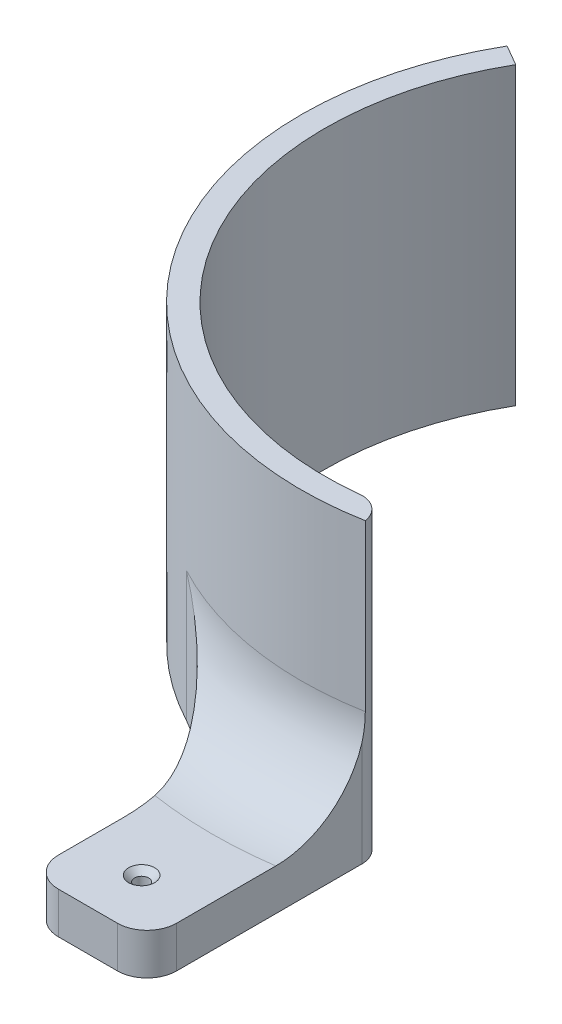
ISO-10303-21;
HEADER;
FILE_DESCRIPTION(('STEP AP214'),'2;1');
FILE_NAME('part.step','',(''),(''),'','','');
FILE_SCHEMA(('AUTOMOTIVE_DESIGN { 1 0 10303 214 1 1 1 1 }'));
ENDSEC;
DATA;
#1=APPLICATION_CONTEXT('core data for automotive mechanical design processes');
#2=APPLICATION_PROTOCOL_DEFINITION('international standard','automotive_design',2000,#1);
#3=PRODUCT_CONTEXT('',#1,'mechanical');
#4=PRODUCT('Part','Part','',(#3));
#5=PRODUCT_RELATED_PRODUCT_CATEGORY('part','',(#4));
#6=PRODUCT_DEFINITION_FORMATION('','',#4);
#7=PRODUCT_DEFINITION_CONTEXT('part definition',#1,'design');
#8=PRODUCT_DEFINITION('design','',#6,#7);
#9=PRODUCT_DEFINITION_SHAPE('','',#8);
#10=(LENGTH_UNIT() NAMED_UNIT(*) SI_UNIT(.MILLI.,.METRE.));
#11=(NAMED_UNIT(*) PLANE_ANGLE_UNIT() SI_UNIT($,.RADIAN.));
#12=(NAMED_UNIT(*) SI_UNIT($,.STERADIAN.) SOLID_ANGLE_UNIT());
#13=UNCERTAINTY_MEASURE_WITH_UNIT(LENGTH_MEASURE(1.E-05),#10,'distance_accuracy_value','');
#14=(GEOMETRIC_REPRESENTATION_CONTEXT(3) GLOBAL_UNCERTAINTY_ASSIGNED_CONTEXT((#13)) GLOBAL_UNIT_ASSIGNED_CONTEXT((#10,
#11,#12)) REPRESENTATION_CONTEXT('',''));
#15=CARTESIAN_POINT('',(0.,0.,0.));
#16=DIRECTION('',(0.,0.,1.));
#17=DIRECTION('',(1.,0.,0.));
#18=AXIS2_PLACEMENT_3D('',#15,#16,#17);
#19=CARTESIAN_POINT('',(0.,50.,0.));
#20=DIRECTION('',(0.,-1.,0.));
#21=DIRECTION('',(0.,0.,-1.));
#22=AXIS2_PLACEMENT_3D('',#19,#20,#21);
#23=CYLINDRICAL_SURFACE('',#22,55.);
#24=CARTESIAN_POINT('',(0.,22.,0.));
#25=DIRECTION('',(0.,1.,0.));
#26=DIRECTION('',(0.,0.,1.));
#27=AXIS2_PLACEMENT_3D('',#24,#25,#26);
#28=CIRCLE('',#27,55.);
#29=CARTESIAN_POINT('',(-25.8823529411765,22.,48.5294117647059));
#30=VERTEX_POINT('',#29);
#31=CARTESIAN_POINT('',(9.957629625156,22.,54.0910862550219));
#32=VERTEX_POINT('',#31);
#33=EDGE_CURVE('E249',#30,#32,#28,.T.);
#34=ORIENTED_EDGE('',*,*,#33,.T.);
#35=DIRECTION('',(0.,-1.,0.));
#36=VECTOR('',#35,1.);
#37=CARTESIAN_POINT('',(9.957629625156,22.,54.0910862550219));
#38=LINE('',#37,#36);
#39=CARTESIAN_POINT('',(9.95762962515597,50.,54.0910862550219));
#40=VERTEX_POINT('',#39);
#41=EDGE_CURVE('E55',#32,#40,#38,.F.);
#42=ORIENTED_EDGE('',*,*,#41,.T.);
#43=CARTESIAN_POINT('',(0.,50.,0.));
#44=DIRECTION('',(0.,1.,0.));
#45=DIRECTION('',(0.,0.,1.));
#46=AXIS2_PLACEMENT_3D('',#43,#44,#45);
#47=CIRCLE('',#46,55.);
#48=CARTESIAN_POINT('',(-47.6313972081442,50.,-27.4999999999999));
#49=VERTEX_POINT('',#48);
#50=EDGE_CURVE('E210',#49,#40,#47,.T.);
#51=ORIENTED_EDGE('',*,*,#50,.F.);
#52=DIRECTION('',(0.,-1.,0.));
#53=VECTOR('',#52,1.);
#54=CARTESIAN_POINT('',(-47.6313972081442,50.,-27.4999999999999));
#55=LINE('',#54,#53);
#56=CARTESIAN_POINT('',(-47.6313972081442,0.,-27.4999999999999));
#57=VERTEX_POINT('',#56);
#58=EDGE_CURVE('E213',#49,#57,#55,.T.);
#59=ORIENTED_EDGE('',*,*,#58,.T.);
#60=CARTESIAN_POINT('',(0.,0.,0.));
#61=DIRECTION('',(0.,1.,0.));
#62=DIRECTION('',(0.,0.,1.));
#63=AXIS2_PLACEMENT_3D('',#60,#61,#62);
#64=CIRCLE('',#63,55.);
#65=CARTESIAN_POINT('',(-25.8823529411765,0.,48.5294117647059));
#66=VERTEX_POINT('',#65);
#67=EDGE_CURVE('E206',#57,#66,#64,.T.);
#68=ORIENTED_EDGE('',*,*,#67,.T.);
#69=DIRECTION('',(0.,-1.,0.));
#70=VECTOR('',#69,1.);
#71=CARTESIAN_POINT('',(-25.8823529411765,50.,48.5294117647059));
#72=LINE('',#71,#70);
#73=EDGE_CURVE('E240',#66,#30,#72,.F.);
#74=ORIENTED_EDGE('',*,*,#73,.T.);
#75=EDGE_LOOP('',(#34,#42,#51,#59,#68,#74));
#76=FACE_BOUND('',#75,.T.);
#77=ADVANCED_FACE('F45',(#76),#23,.T.);
#78=CARTESIAN_POINT('',(10.,50.,54.0832691319598));
#79=DIRECTION('',(-1.,0.,0.));
#80=DIRECTION('',(0.,0.,1.));
#81=AXIS2_PLACEMENT_3D('',#78,#79,#80);
#82=PLANE('',#81);
#83=DIRECTION('',(0.,0.,-1.));
#84=VECTOR('',#83,1.);
#85=CARTESIAN_POINT('',(10.,0.,54.0832691319598));
#86=LINE('',#85,#84);
#87=CARTESIAN_POINT('',(10.,0.,86.0832691319598));
#88=VERTEX_POINT('',#87);
#89=CARTESIAN_POINT('',(10.,0.,54.6717477313466));
#90=VERTEX_POINT('',#89);
#91=EDGE_CURVE('E149',#88,#90,#86,.T.);
#92=ORIENTED_EDGE('',*,*,#91,.T.);
#93=DIRECTION('',(0.,1.,0.));
#94=VECTOR('',#93,1.);
#95=CARTESIAN_POINT('',(10.,50.,54.6717477313466));
#96=LINE('',#95,#94);
#97=CARTESIAN_POINT('',(10.,17.8734748648914,54.6717477313516));
#98=VERTEX_POINT('',#97);
#99=EDGE_CURVE('E287',#90,#98,#96,.T.);
#100=ORIENTED_EDGE('',*,*,#99,.T.);
#101=CARTESIAN_POINT('',(9.99999999999998,22.,54.0832691319598));
#102=CARTESIAN_POINT('',(9.99999999999999,21.7913941868465,54.083269063297));
#103=CARTESIAN_POINT('',(10.,21.5828140490278,54.087695266295));
#104=CARTESIAN_POINT('',(10.,21.1660300561729,54.1053865205836));
#105=CARTESIAN_POINT('',(10.,20.9578261991616,54.1186515253481));
#106=CARTESIAN_POINT('',(10.,20.3343926934916,54.1716732522276));
#107=CARTESIAN_POINT('',(10.,19.9202106915713,54.2246567056413));
#108=CARTESIAN_POINT('',(10.,19.0983989863994,54.3653749210633));
#109=CARTESIAN_POINT('',(10.,18.6907615480932,54.4530649448665));
#110=CARTESIAN_POINT('',(10.,17.8843199208566,54.6624997243969));
#111=CARTESIAN_POINT('',(10.,17.4855156974027,54.7842443470008));
#112=CARTESIAN_POINT('',(10.,16.6994570282904,55.0608648384058));
#113=CARTESIAN_POINT('',(10.,16.3122056590117,55.2157494438056));
#114=CARTESIAN_POINT('',(10.,15.5520444340006,55.5574299133334));
#115=CARTESIAN_POINT('',(10.,15.1791347324817,55.7442261204838));
#116=CARTESIAN_POINT('',(10.,14.4502302637346,56.1482968990162));
#117=CARTESIAN_POINT('',(10.,14.0942349691362,56.3655705193145));
#118=CARTESIAN_POINT('',(10.,13.4015530331304,56.8289730845595));
#119=CARTESIAN_POINT('',(10.,13.0648664321544,57.0751020899248));
#120=CARTESIAN_POINT('',(10.,12.4103276544576,57.5965746596603));
#121=CARTESIAN_POINT('',(10.,12.0926558745476,57.8721446503521));
#122=CARTESIAN_POINT('',(10.,11.481351560026,58.4487684823968));
#123=CARTESIAN_POINT('',(10.,11.1877192405208,58.7498225517336));
#124=CARTESIAN_POINT('',(10.,10.62637804747,59.3753158658484));
#125=CARTESIAN_POINT('',(10.,10.3586748712019,59.6997602228606));
#126=CARTESIAN_POINT('',(10.,9.85102518152701,60.3696747736542));
#127=CARTESIAN_POINT('',(10.,9.61107854567037,60.7151448746687));
#128=CARTESIAN_POINT('',(10.,9.1571377266229,61.4300074618837));
#129=CARTESIAN_POINT('',(10.,8.94358488089955,61.7996802592352));
#130=CARTESIAN_POINT('',(10.,8.54811419068921,62.5555849231635));
#131=CARTESIAN_POINT('',(10.,8.3661969733221,62.9418171178118));
#132=CARTESIAN_POINT('',(10.,8.03528721161652,63.7279596895726));
#133=CARTESIAN_POINT('',(10.,7.88628261009126,64.1278649954803));
#134=CARTESIAN_POINT('',(10.,7.62214172744712,64.9386498944309));
#135=CARTESIAN_POINT('',(10.,7.50699825505663,65.3495271370558));
#136=CARTESIAN_POINT('',(10.,7.34124954037383,66.0525174759621));
#137=CARTESIAN_POINT('',(10.,7.28167490380704,66.3425506211082));
#138=CARTESIAN_POINT('',(10.,7.17940721602538,66.9255743231493));
#139=CARTESIAN_POINT('',(10.,7.13671299133285,67.2185646730153));
#140=CARTESIAN_POINT('',(10.,7.06840571867453,67.8061118467169));
#141=CARTESIAN_POINT('',(10.,7.04276895588569,68.1006659194171));
#142=CARTESIAN_POINT('',(10.,7.00855976974638,68.6908227083139));
#143=CARTESIAN_POINT('',(10.,6.99999078924875,68.9864256240348));
#144=CARTESIAN_POINT('',(10.,7.,69.2820323027551));
#145=B_SPLINE_CURVE_WITH_KNOTS('',3,(#101,#102,#103,#104,#105,#106,#107,#108,#109,#110,#111,
#112,#113,#114,#115,#116,#117,#118,#119,#120,#121,#122,#123,#124,#125,#126,#127,#128,#129,#130,
#131,#132,#133,#134,#135,#136,#137,#138,#139,#140,#141,#142,#143,#144),.UNSPECIFIED.,.F.,.F.,(4,
2,2,2,2,2,2,2,2,2,2,2,2,2,2,2,2,2,2,2,2,4),(0.,0.625719261940472,1.25143523021909,
2.50247718266635,3.75191171524951,5.00134136372051,6.25110080247818,7.50087367592636,
8.75060755741049,10.0003440556863,11.2604982076405,12.5206636342933,13.781105325462,
15.041541455898,16.3208104379879,17.6001047764127,18.8789296788102,20.1574827937667,
21.0452918235538,21.9330391245554,22.8195496056856,23.7062388924798),.UNSPECIFIED.);
#146=CARTESIAN_POINT('',(10.,7.,69.2820323027551));
#147=VERTEX_POINT('',#146);
#148=EDGE_CURVE('E255',#98,#147,#145,.T.);
#149=ORIENTED_EDGE('',*,*,#148,.T.);
#150=DIRECTION('',(0.,0.,-1.));
#151=VECTOR('',#150,1.);
#152=CARTESIAN_POINT('',(10.,7.,0.));
#153=LINE('',#152,#151);
#154=CARTESIAN_POINT('',(10.,7.,86.0832691319598));
#155=VERTEX_POINT('',#154);
#156=EDGE_CURVE('E178',#155,#147,#153,.T.);
#157=ORIENTED_EDGE('',*,*,#156,.F.);
#158=DIRECTION('',(0.,-1.,0.));
#159=VECTOR('',#158,1.);
#160=CARTESIAN_POINT('',(10.,7.,86.0832691319598));
#161=LINE('',#160,#159);
#162=EDGE_CURVE('E195',#155,#88,#161,.T.);
#163=ORIENTED_EDGE('',*,*,#162,.T.);
#164=EDGE_LOOP('',(#92,#100,#149,#157,#163));
#165=FACE_BOUND('',#164,.T.);
#166=ADVANCED_FACE('F270',(#165),#82,.F.);
#167=CARTESIAN_POINT('',(0.,50.,0.));
#168=DIRECTION('',(0.,-1.,0.));
#169=DIRECTION('',(0.,0.,-1.));
#170=AXIS2_PLACEMENT_3D('',#167,#168,#169);
#171=CYLINDRICAL_SURFACE('',#170,51.);
#172=CARTESIAN_POINT('',(0.,50.,0.));
#173=DIRECTION('',(0.,1.,0.));
#174=DIRECTION('',(0.,0.,1.));
#175=AXIS2_PLACEMENT_3D('',#172,#173,#174);
#176=CIRCLE('',#175,51.);
#177=CARTESIAN_POINT('',(-44.1672955930064,50.,-25.4999999999999));
#178=VERTEX_POINT('',#177);
#179=CARTESIAN_POINT('',(5.56363636363637,50.,50.6956206236123));
#180=VERTEX_POINT('',#179);
#181=EDGE_CURVE('E201',#178,#180,#176,.T.);
#182=ORIENTED_EDGE('',*,*,#181,.T.);
#183=DIRECTION('',(0.,-1.,0.));
#184=VECTOR('',#183,1.);
#185=CARTESIAN_POINT('',(5.56363636363637,50.,50.6956206236123));
#186=LINE('',#185,#184);
#187=CARTESIAN_POINT('',(5.56363636363637,0.,50.6956206236123));
#188=VERTEX_POINT('',#187);
#189=EDGE_CURVE('E294',#180,#188,#186,.T.);
#190=ORIENTED_EDGE('',*,*,#189,.T.);
#191=CARTESIAN_POINT('',(0.,0.,0.));
#192=DIRECTION('',(0.,1.,0.));
#193=DIRECTION('',(0.,0.,1.));
#194=AXIS2_PLACEMENT_3D('',#191,#192,#193);
#195=CIRCLE('',#194,51.);
#196=CARTESIAN_POINT('',(-44.1672955930064,0.,-25.4999999999999));
#197=VERTEX_POINT('',#196);
#198=EDGE_CURVE('E217',#197,#188,#195,.T.);
#199=ORIENTED_EDGE('',*,*,#198,.F.);
#200=DIRECTION('',(0.,-1.,0.));
#201=VECTOR('',#200,1.);
#202=CARTESIAN_POINT('',(-44.1672955930064,50.,-25.4999999999999));
#203=LINE('',#202,#201);
#204=EDGE_CURVE('E230',#178,#197,#203,.T.);
#205=ORIENTED_EDGE('',*,*,#204,.F.);
#206=EDGE_LOOP('',(#182,#190,#199,#205));
#207=FACE_BOUND('',#206,.T.);
#208=ADVANCED_FACE('F313',(#207),#171,.F.);
#209=CARTESIAN_POINT('',(-47.6313972081442,50.,-27.4999999999999));
#210=DIRECTION('',(0.499999999999999,0.,-0.866025403784439));
#211=DIRECTION('',(-0.866025403784439,0.,-0.5));
#212=AXIS2_PLACEMENT_3D('',#209,#210,#211);
#213=PLANE('',#212);
#214=DIRECTION('',(0.866025403784439,0.,0.499999999999999));
#215=VECTOR('',#214,1.);
#216=CARTESIAN_POINT('',(-47.6313972081442,0.,-27.4999999999999));
#217=LINE('',#216,#215);
#218=EDGE_CURVE('E221',#57,#197,#217,.T.);
#219=ORIENTED_EDGE('',*,*,#218,.F.);
#220=ORIENTED_EDGE('',*,*,#58,.F.);
#221=DIRECTION('',(0.866025403784439,0.,0.499999999999999));
#222=VECTOR('',#221,1.);
#223=CARTESIAN_POINT('',(-47.6313972081442,50.,-27.4999999999999));
#224=LINE('',#223,#222);
#225=EDGE_CURVE('E205',#49,#178,#224,.T.);
#226=ORIENTED_EDGE('',*,*,#225,.T.);
#227=ORIENTED_EDGE('',*,*,#204,.T.);
#228=EDGE_LOOP('',(#219,#220,#226,#227));
#229=FACE_BOUND('',#228,.T.);
#230=ADVANCED_FACE('F317',(#229),#213,.T.);
#231=CARTESIAN_POINT('',(0.,50.,0.));
#232=DIRECTION('',(0.,1.,0.));
#233=DIRECTION('',(0.,0.,1.));
#234=AXIS2_PLACEMENT_3D('',#231,#232,#233);
#235=PLANE('',#234);
#236=ORIENTED_EDGE('',*,*,#50,.T.);
#237=CARTESIAN_POINT('',(6.,50.,54.6717477313466));
#238=DIRECTION('',(0.,1.,0.));
#239=DIRECTION('',(0.,0.,1.));
#240=AXIS2_PLACEMENT_3D('',#237,#238,#239);
#241=CIRCLE('',#240,4.);
#242=EDGE_CURVE('E11',#40,#180,#241,.T.);
#243=ORIENTED_EDGE('',*,*,#242,.T.);
#244=ORIENTED_EDGE('',*,*,#181,.F.);
#245=ORIENTED_EDGE('',*,*,#225,.F.);
#246=EDGE_LOOP('',(#236,#243,#244,#245));
#247=FACE_BOUND('',#246,.T.);
#248=ADVANCED_FACE('F310',(#247),#235,.T.);
#249=CARTESIAN_POINT('',(0.,0.,0.));
#250=DIRECTION('',(0.,1.,0.));
#251=DIRECTION('',(0.,0.,1.));
#252=AXIS2_PLACEMENT_3D('',#249,#250,#251);
#253=PLANE('',#252);
#254=CARTESIAN_POINT('',(0.,0.,82.));
#255=DIRECTION('',(0.,1.,0.));
#256=DIRECTION('',(0.,0.,1.));
#257=AXIS2_PLACEMENT_3D('',#254,#255,#256);
#258=CIRCLE('',#257,1.19999999999999);
#259=CARTESIAN_POINT('',(0.,0.,83.2));
#260=VERTEX_POINT('',#259);
#261=EDGE_CURVE('E187',#260,#260,#258,.T.);
#262=ORIENTED_EDGE('',*,*,#261,.T.);
#263=EDGE_LOOP('',(#262));
#264=FACE_BOUND('',#263,.T.);
#265=ORIENTED_EDGE('',*,*,#198,.T.);
#266=CARTESIAN_POINT('',(6.,0.,54.6717477313466));
#267=DIRECTION('',(0.,1.,0.));
#268=DIRECTION('',(0.,0.,1.));
#269=AXIS2_PLACEMENT_3D('',#266,#267,#268);
#270=CIRCLE('',#269,4.);
#271=EDGE_CURVE('E292',#188,#90,#270,.F.);
#272=ORIENTED_EDGE('',*,*,#271,.T.);
#273=ORIENTED_EDGE('',*,*,#91,.F.);
#274=CARTESIAN_POINT('',(5.00000000000001,0.,86.0832691319598));
#275=DIRECTION('',(0.,1.,0.));
#276=DIRECTION('',(0.,0.,1.));
#277=AXIS2_PLACEMENT_3D('',#274,#275,#276);
#278=CIRCLE('',#277,5.00000000000001);
#279=CARTESIAN_POINT('',(5.00000000000001,0.,91.0832691319598));
#280=VERTEX_POINT('',#279);
#281=EDGE_CURVE('E170',#88,#280,#278,.F.);
#282=ORIENTED_EDGE('',*,*,#281,.T.);
#283=DIRECTION('',(1.,0.,0.));
#284=VECTOR('',#283,1.);
#285=CARTESIAN_POINT('',(0.,0.,91.0832691319598));
#286=LINE('',#285,#284);
#287=CARTESIAN_POINT('',(-5.00000000000001,0.,91.0832691319598));
#288=VERTEX_POINT('',#287);
#289=EDGE_CURVE('E186',#288,#280,#286,.T.);
#290=ORIENTED_EDGE('',*,*,#289,.F.);
#291=CARTESIAN_POINT('',(-5.00000000000001,0.,86.0832691319598));
#292=DIRECTION('',(0.,1.,0.));
#293=DIRECTION('',(0.,0.,1.));
#294=AXIS2_PLACEMENT_3D('',#291,#292,#293);
#295=CIRCLE('',#294,5.00000000000001);
#296=CARTESIAN_POINT('',(-10.,0.,86.0832691319598));
#297=VERTEX_POINT('',#296);
#298=EDGE_CURVE('E144',#288,#297,#295,.F.);
#299=ORIENTED_EDGE('',*,*,#298,.T.);
#300=DIRECTION('',(0.,0.,1.));
#301=VECTOR('',#300,1.);
#302=CARTESIAN_POINT('',(-10.,0.,0.));
#303=LINE('',#302,#301);
#304=CARTESIAN_POINT('',(-10.,0.,75.));
#305=VERTEX_POINT('',#304);
#306=EDGE_CURVE('E167',#305,#297,#303,.T.);
#307=ORIENTED_EDGE('',*,*,#306,.F.);
#308=CARTESIAN_POINT('',(-40.,0.,75.));
#309=DIRECTION('',(0.,1.,0.));
#310=DIRECTION('',(0.,0.,1.));
#311=AXIS2_PLACEMENT_3D('',#308,#309,#310);
#312=CIRCLE('',#311,30.);
#313=EDGE_CURVE('E243',#305,#66,#312,.T.);
#314=ORIENTED_EDGE('',*,*,#313,.T.);
#315=ORIENTED_EDGE('',*,*,#67,.F.);
#316=ORIENTED_EDGE('',*,*,#218,.T.);
#317=EDGE_LOOP('',(#265,#272,#273,#282,#290,#299,#307,#314,#315,#316));
#318=FACE_BOUND('',#317,.T.);
#319=ADVANCED_FACE('F320',(#264,#318),#253,.F.);
#320=CARTESIAN_POINT('',(-5.00000000000001,7.,86.0832691319598));
#321=DIRECTION('',(0.,-1.,0.));
#322=DIRECTION('',(0.,0.,-1.));
#323=AXIS2_PLACEMENT_3D('',#320,#321,#322);
#324=CYLINDRICAL_SURFACE('',#323,5.00000000000001);
#325=ORIENTED_EDGE('',*,*,#298,.F.);
#326=DIRECTION('',(0.,-1.,0.));
#327=VECTOR('',#326,1.);
#328=CARTESIAN_POINT('',(-5.00000000000001,7.,91.0832691319598));
#329=LINE('',#328,#327);
#330=CARTESIAN_POINT('',(-5.00000000000001,7.,91.0832691319598));
#331=VERTEX_POINT('',#330);
#332=EDGE_CURVE('E137',#331,#288,#329,.T.);
#333=ORIENTED_EDGE('',*,*,#332,.F.);
#334=CARTESIAN_POINT('',(-5.00000000000001,7.,86.0832691319598));
#335=DIRECTION('',(0.,1.,0.));
#336=DIRECTION('',(0.,0.,1.));
#337=AXIS2_PLACEMENT_3D('',#334,#335,#336);
#338=CIRCLE('',#337,5.00000000000001);
#339=CARTESIAN_POINT('',(-10.,7.,86.0832691319598));
#340=VERTEX_POINT('',#339);
#341=EDGE_CURVE('E142',#331,#340,#338,.F.);
#342=ORIENTED_EDGE('',*,*,#341,.T.);
#343=DIRECTION('',(0.,-1.,0.));
#344=VECTOR('',#343,1.);
#345=CARTESIAN_POINT('',(-10.,7.,86.0832691319598));
#346=LINE('',#345,#344);
#347=EDGE_CURVE('E183',#340,#297,#346,.T.);
#348=ORIENTED_EDGE('',*,*,#347,.T.);
#349=EDGE_LOOP('',(#325,#333,#342,#348));
#350=FACE_BOUND('',#349,.T.);
#351=ADVANCED_FACE('F139',(#350),#324,.T.);
#352=CARTESIAN_POINT('',(0.,7.,91.0832691319598));
#353=DIRECTION('',(0.,0.,-1.));
#354=DIRECTION('',(-1.,0.,0.));
#355=AXIS2_PLACEMENT_3D('',#352,#353,#354);
#356=PLANE('',#355);
#357=ORIENTED_EDGE('',*,*,#289,.T.);
#358=DIRECTION('',(0.,-1.,0.));
#359=VECTOR('',#358,1.);
#360=CARTESIAN_POINT('',(5.00000000000001,7.,91.0832691319598));
#361=LINE('',#360,#359);
#362=CARTESIAN_POINT('',(5.00000000000001,7.,91.0832691319598));
#363=VERTEX_POINT('',#362);
#364=EDGE_CURVE('E150',#363,#280,#361,.T.);
#365=ORIENTED_EDGE('',*,*,#364,.F.);
#366=DIRECTION('',(1.,0.,0.));
#367=VECTOR('',#366,1.);
#368=CARTESIAN_POINT('',(0.,7.,91.0832691319598));
#369=LINE('',#368,#367);
#370=EDGE_CURVE('E153',#331,#363,#369,.T.);
#371=ORIENTED_EDGE('',*,*,#370,.F.);
#372=ORIENTED_EDGE('',*,*,#332,.T.);
#373=EDGE_LOOP('',(#357,#365,#371,#372));
#374=FACE_BOUND('',#373,.T.);
#375=ADVANCED_FACE('F154',(#374),#356,.F.);
#376=CARTESIAN_POINT('',(5.00000000000001,7.,86.0832691319598));
#377=DIRECTION('',(0.,-1.,0.));
#378=DIRECTION('',(0.,0.,-1.));
#379=AXIS2_PLACEMENT_3D('',#376,#377,#378);
#380=CYLINDRICAL_SURFACE('',#379,5.00000000000001);
#381=ORIENTED_EDGE('',*,*,#281,.F.);
#382=ORIENTED_EDGE('',*,*,#162,.F.);
#383=CARTESIAN_POINT('',(5.00000000000001,7.,86.0832691319598));
#384=DIRECTION('',(0.,1.,0.));
#385=DIRECTION('',(0.,0.,1.));
#386=AXIS2_PLACEMENT_3D('',#383,#384,#385);
#387=CIRCLE('',#386,5.00000000000001);
#388=EDGE_CURVE('E159',#155,#363,#387,.F.);
#389=ORIENTED_EDGE('',*,*,#388,.T.);
#390=ORIENTED_EDGE('',*,*,#364,.T.);
#391=EDGE_LOOP('',(#381,#382,#389,#390));
#392=FACE_BOUND('',#391,.T.);
#393=ADVANCED_FACE('F326',(#392),#380,.T.);
#394=CARTESIAN_POINT('',(-10.,7.,0.));
#395=DIRECTION('',(1.,0.,0.));
#396=DIRECTION('',(0.,0.,-1.));
#397=AXIS2_PLACEMENT_3D('',#394,#395,#396);
#398=PLANE('',#397);
#399=DIRECTION('',(0.,0.,1.));
#400=VECTOR('',#399,1.);
#401=CARTESIAN_POINT('',(-10.,7.,0.));
#402=LINE('',#401,#400);
#403=CARTESIAN_POINT('',(-10.,7.,75.));
#404=VERTEX_POINT('',#403);
#405=EDGE_CURVE('E164',#404,#340,#402,.T.);
#406=ORIENTED_EDGE('',*,*,#405,.F.);
#407=DIRECTION('',(0.,1.,0.));
#408=VECTOR('',#407,1.);
#409=CARTESIAN_POINT('',(-10.,0.,75.));
#410=LINE('',#409,#408);
#411=EDGE_CURVE('E233',#404,#305,#410,.F.);
#412=ORIENTED_EDGE('',*,*,#411,.T.);
#413=ORIENTED_EDGE('',*,*,#306,.T.);
#414=ORIENTED_EDGE('',*,*,#347,.F.);
#415=EDGE_LOOP('',(#406,#412,#413,#414));
#416=FACE_BOUND('',#415,.T.);
#417=ADVANCED_FACE('F323',(#416),#398,.F.);
#418=CARTESIAN_POINT('',(0.,7.,0.));
#419=DIRECTION('',(0.,1.,0.));
#420=DIRECTION('',(0.,0.,1.));
#421=AXIS2_PLACEMENT_3D('',#418,#419,#420);
#422=PLANE('',#421);
#423=CARTESIAN_POINT('',(0.,7.,82.));
#424=DIRECTION('',(0.,1.,0.));
#425=DIRECTION('',(0.,0.,1.));
#426=AXIS2_PLACEMENT_3D('',#423,#424,#425);
#427=CIRCLE('',#426,2.2);
#428=CARTESIAN_POINT('',(0.,7.,84.2));
#429=VERTEX_POINT('',#428);
#430=EDGE_CURVE('E375',#429,#429,#427,.T.);
#431=ORIENTED_EDGE('',*,*,#430,.F.);
#432=EDGE_LOOP('',(#431));
#433=FACE_BOUND('',#432,.T.);
#434=ORIENTED_EDGE('',*,*,#156,.T.);
#435=CARTESIAN_POINT('',(0.,7.,0.));
#436=DIRECTION('',(0.,1.,0.));
#437=DIRECTION('',(0.,0.,1.));
#438=AXIS2_PLACEMENT_3D('',#435,#436,#437);
#439=CIRCLE('',#438,70.);
#440=CARTESIAN_POINT('',(-10.5664178685825,7.,69.1979104700894));
#441=VERTEX_POINT('',#440);
#442=EDGE_CURVE('E252',#147,#441,#439,.F.);
#443=ORIENTED_EDGE('',*,*,#442,.T.);
#444=CARTESIAN_POINT('',(-40.,7.,75.));
#445=DIRECTION('',(0.,1.,0.));
#446=DIRECTION('',(0.,0.,1.));
#447=AXIS2_PLACEMENT_3D('',#444,#445,#446);
#448=CIRCLE('',#447,30.);
#449=EDGE_CURVE('E246',#441,#404,#448,.F.);
#450=ORIENTED_EDGE('',*,*,#449,.T.);
#451=ORIENTED_EDGE('',*,*,#405,.T.);
#452=ORIENTED_EDGE('',*,*,#341,.F.);
#453=ORIENTED_EDGE('',*,*,#370,.T.);
#454=ORIENTED_EDGE('',*,*,#388,.F.);
#455=EDGE_LOOP('',(#434,#443,#450,#451,#452,#453,#454));
#456=FACE_BOUND('',#455,.T.);
#457=ADVANCED_FACE('F162',(#433,#456),#422,.T.);
#458=CARTESIAN_POINT('',(0.,7.,82.));
#459=DIRECTION('',(0.,1.,0.));
#460=DIRECTION('',(0.,0.,1.));
#461=AXIS2_PLACEMENT_3D('',#458,#459,#460);
#462=CYLINDRICAL_SURFACE('',#461,1.19999999999999);
#463=CARTESIAN_POINT('',(0.,6.,82.));
#464=DIRECTION('',(0.,1.,0.));
#465=DIRECTION('',(0.,0.,1.));
#466=AXIS2_PLACEMENT_3D('',#463,#464,#465);
#467=CIRCLE('',#466,1.2);
#468=CARTESIAN_POINT('',(0.,6.,83.2));
#469=VERTEX_POINT('',#468);
#470=EDGE_CURVE('E173',#469,#469,#467,.T.);
#471=ORIENTED_EDGE('',*,*,#470,.T.);
#472=EDGE_LOOP('',(#471));
#473=FACE_BOUND('',#472,.T.);
#474=ORIENTED_EDGE('',*,*,#261,.F.);
#475=EDGE_LOOP('',(#474));
#476=FACE_BOUND('',#475,.T.);
#477=ADVANCED_FACE('F359',(#473,#476),#462,.F.);
#478=CARTESIAN_POINT('',(0.,7.,82.));
#479=DIRECTION('',(0.,1.,0.));
#480=DIRECTION('',(0.,0.,1.));
#481=AXIS2_PLACEMENT_3D('',#478,#479,#480);
#482=CONICAL_SURFACE('',#481,2.2,0.785398163397447);
#483=ORIENTED_EDGE('',*,*,#470,.F.);
#484=EDGE_LOOP('',(#483));
#485=FACE_BOUND('',#484,.T.);
#486=ORIENTED_EDGE('',*,*,#430,.T.);
#487=EDGE_LOOP('',(#486));
#488=FACE_BOUND('',#487,.T.);
#489=ADVANCED_FACE('F363',(#485,#488),#482,.F.);
#490=CARTESIAN_POINT('',(-40.,50.,75.));
#491=DIRECTION('',(0.,-1.,0.));
#492=DIRECTION('',(0.,0.,-1.));
#493=AXIS2_PLACEMENT_3D('',#490,#491,#492);
#494=CYLINDRICAL_SURFACE('',#493,30.);
#495=ORIENTED_EDGE('',*,*,#449,.F.);
#496=CARTESIAN_POINT('',(-10.5664178685825,7.,69.1979104700894));
#497=CARTESIAN_POINT('',(-10.6140278717149,6.99999723291753,68.9563652606619));
#498=CARTESIAN_POINT('',(-10.6646111675148,7.00536422985767,68.7154570541693));
#499=CARTESIAN_POINT('',(-10.7715713372024,7.02646708344324,68.2354326161275));
#500=CARTESIAN_POINT('',(-10.8279471109349,7.0422009741838,67.9963160535168));
#501=CARTESIAN_POINT('',(-11.0053368917884,7.10432133564813,67.2832004405465));
#502=CARTESIAN_POINT('',(-11.1347959045356,7.16562937390446,66.8125115037322));
#503=CARTESIAN_POINT('',(-11.4128088754018,7.32366271002771,65.8894448752082));
#504=CARTESIAN_POINT('',(-11.5611119863459,7.41994908162159,65.4369142688847));
#505=CARTESIAN_POINT('',(-11.876279069916,7.64455314350879,64.5463110260054));
#506=CARTESIAN_POINT('',(-12.0431527529695,7.77288763559118,64.1082461101712));
#507=CARTESIAN_POINT('',(-12.4465329897912,8.10118060212283,63.1184216165083));
#508=CARTESIAN_POINT('',(-12.6888421557539,8.31106357833904,62.5723132465938));
#509=CARTESIAN_POINT('',(-13.1977974917449,8.77182957684856,61.5096576715444));
#510=CARTESIAN_POINT('',(-13.4644489099563,9.02272144991009,60.9931168804148));
#511=CARTESIAN_POINT('',(-14.0201447436614,9.5603770590183,59.9873706065273));
#512=CARTESIAN_POINT('',(-14.3093040721099,9.84733019061381,59.4983307840612));
#513=CARTESIAN_POINT('',(-14.9059047211668,10.4503096164462,58.5500654661915));
#514=CARTESIAN_POINT('',(-15.2133528179621,10.7663467106312,58.0908511549516));
#515=CARTESIAN_POINT('',(-15.77989054895,11.3556680058584,57.2919550279698));
#516=CARTESIAN_POINT('',(-16.0360970842325,11.624573642056,56.9469583667524));
#517=CARTESIAN_POINT('',(-16.5575440714026,12.175398947358,56.2748260548917));
#518=CARTESIAN_POINT('',(-16.8227825485692,12.457315776457,55.9476865402066));
#519=CARTESIAN_POINT('',(-17.3617480886738,13.0324942150904,55.3103108362401));
#520=CARTESIAN_POINT('',(-17.6354809042232,13.3257635476628,55.0000865125188));
#521=CARTESIAN_POINT('',(-18.1906656757806,13.9217933540449,54.3960876328965));
#522=CARTESIAN_POINT('',(-18.4721180195981,14.2245543047989,54.1023139056947));
#523=CARTESIAN_POINT('',(-19.042125029885,14.8379098351525,53.5307124429036));
#524=CARTESIAN_POINT('',(-19.3306762465325,15.1485006114551,53.2528771722211));
#525=CARTESIAN_POINT('',(-19.9146681219953,15.7763186914505,52.7123860355566));
#526=CARTESIAN_POINT('',(-20.2101087586969,16.0935459738409,52.4497301208611));
#527=CARTESIAN_POINT('',(-20.8075180177885,16.7332944845338,51.9391464778987));
#528=CARTESIAN_POINT('',(-21.1094837475664,17.0558133523776,51.6912123989109));
#529=CARTESIAN_POINT('',(-21.7199325683882,17.7051845407955,51.2094488733793));
#530=CARTESIAN_POINT('',(-22.0284157286304,18.0320369073663,50.9756195766934));
#531=CARTESIAN_POINT('',(-22.6232198753239,18.6588925524093,50.5424828803018));
#532=CARTESIAN_POINT('',(-22.9089749558094,18.9586054098277,50.3419770846488));
#533=CARTESIAN_POINT('',(-23.4857867698408,19.5600101229376,49.9520075798869));
#534=CARTESIAN_POINT('',(-23.7768430406091,19.8617018044266,49.7625429129284));
#535=CARTESIAN_POINT('',(-24.6574657115361,20.7681276750307,49.2107286929173));
#536=CARTESIAN_POINT('',(-25.2551650031537,21.3749318378803,48.8644654591891));
#537=CARTESIAN_POINT('',(-25.8700431239614,21.9877351330474,48.535979763103));
#538=CARTESIAN_POINT('',(-25.8761974691855,21.9938675748304,48.5326946879209));
#539=CARTESIAN_POINT('',(-25.8823529411765,22.,48.5294117647059));
#540=B_SPLINE_CURVE_WITH_KNOTS('',3,(#496,#497,#498,#499,#500,#501,#502,#503,#504,#505,#506,
#507,#508,#509,#510,#511,#512,#513,#514,#515,#516,#517,#518,#519,#520,#521,#522,#523,#524,#525,
#526,#527,#528,#529,#530,#531,#532,#533,#534,#535,#536,#537,#538,#539),.UNSPECIFIED.,.F.,.F.,(4,
2,2,2,2,2,2,2,2,2,2,2,2,2,2,2,2,2,2,2,2,4),(0.,0.738409888586758,1.47667979059742,
2.9504059719124,4.40624410482672,5.86284709468226,7.75966950679429,9.65690184354128,
11.5645511847137,13.4729117870559,14.9931217237868,16.5130013931698,18.0339338529154,
19.554942860883,21.0752267652991,22.595505790549,24.1151241590874,25.6347586701524,
27.0148584782195,28.3948383798858,31.1514859207842,31.1793511435812),.UNSPECIFIED.);
#541=EDGE_CURVE('E263',#441,#30,#540,.T.);
#542=ORIENTED_EDGE('',*,*,#541,.T.);
#543=ORIENTED_EDGE('',*,*,#73,.F.);
#544=ORIENTED_EDGE('',*,*,#313,.F.);
#545=ORIENTED_EDGE('',*,*,#411,.F.);
#546=EDGE_LOOP('',(#495,#542,#543,#544,#545));
#547=FACE_BOUND('',#546,.T.);
#548=ADVANCED_FACE('F276',(#547),#494,.F.);
#549=CARTESIAN_POINT('',(0.,22.,0.));
#550=DIRECTION('',(0.,1.,0.));
#551=DIRECTION('',(0.,0.,1.));
#552=AXIS2_PLACEMENT_3D('',#549,#550,#551);
#553=TOROIDAL_SURFACE('',#552,70.,15.);
#554=ORIENTED_EDGE('',*,*,#148,.F.);
#555=CARTESIAN_POINT('',(10.,17.8734748648905,54.6717477313466));
#556=CARTESIAN_POINT('',(9.99998354441084,18.0411960156939,54.6229595179521));
#557=CARTESIAN_POINT('',(9.99910702567574,18.2098154563718,54.577288905646));
#558=CARTESIAN_POINT('',(9.99619747062113,18.5485915593904,54.4921518063312));
#559=CARTESIAN_POINT('',(9.99416451917165,18.7187481080218,54.4526848643094));
#560=CARTESIAN_POINT('',(9.98951709233042,19.0595166610071,54.3800973194038));
#561=CARTESIAN_POINT('',(9.98690555091781,19.2301222215788,54.346946213522));
#562=CARTESIAN_POINT('',(9.98154055039095,19.5724018242193,54.2867135423792));
#563=CARTESIAN_POINT('',(9.9787870886539,19.7440758859832,54.2596320893398));
#564=CARTESIAN_POINT('',(9.9735081012976,20.0882647715848,54.2115095392471));
#565=CARTESIAN_POINT('',(9.97098256704611,20.2607795633207,54.1904682133716));
#566=CARTESIAN_POINT('',(9.96644411418533,20.6064421988721,54.1543993506035));
#567=CARTESIAN_POINT('',(9.96443119287688,20.7795900393495,54.1393717820452));
#568=CARTESIAN_POINT('',(9.96111968438054,21.1271728547669,54.1152511529207));
#569=CARTESIAN_POINT('',(9.95982470845029,21.3016099431417,54.1061880516393));
#570=CARTESIAN_POINT('',(9.95807218283054,21.6506980656646,54.0941062831159));
#571=CARTESIAN_POINT('',(9.95761463568938,21.8253491004621,54.0910876342676));
#572=CARTESIAN_POINT('',(9.957629625156,22.,54.0910862550219));
#573=B_SPLINE_CURVE_WITH_KNOTS('',3,(#555,#556,#557,#558,#559,#560,#561,#562,#563,#564,#565,
#566,#567,#568,#569,#570,#571,#572),.UNSPECIFIED.,.F.,.F.,(4,2,2,2,2,2,2,2,4),(0.,
0.52397537012989,1.04791229091981,1.56925082720244,2.09059900169167,2.61192742299482,
3.13325309918923,3.65717778300476,4.18110406115075),.UNSPECIFIED.);
#574=EDGE_CURVE('E69',#98,#32,#573,.T.);
#575=ORIENTED_EDGE('',*,*,#574,.T.);
#576=ORIENTED_EDGE('',*,*,#33,.F.);
#577=ORIENTED_EDGE('',*,*,#541,.F.);
#578=ORIENTED_EDGE('',*,*,#442,.F.);
#579=EDGE_LOOP('',(#554,#575,#576,#577,#578));
#580=FACE_BOUND('',#579,.T.);
#581=ADVANCED_FACE('F273',(#580),#553,.F.);
#582=CARTESIAN_POINT('',(6.,50.,54.6717477313466));
#583=DIRECTION('',(0.,-1.,0.));
#584=DIRECTION('',(0.,0.,-1.));
#585=AXIS2_PLACEMENT_3D('',#582,#583,#584);
#586=CYLINDRICAL_SURFACE('',#585,4.);
#587=ORIENTED_EDGE('',*,*,#574,.F.);
#588=ORIENTED_EDGE('',*,*,#99,.F.);
#589=ORIENTED_EDGE('',*,*,#271,.F.);
#590=ORIENTED_EDGE('',*,*,#189,.F.);
#591=ORIENTED_EDGE('',*,*,#242,.F.);
#592=ORIENTED_EDGE('',*,*,#41,.F.);
#593=EDGE_LOOP('',(#587,#588,#589,#590,#591,#592));
#594=FACE_BOUND('',#593,.T.);
#595=ADVANCED_FACE('F47',(#594),#586,.T.);
#596=CLOSED_SHELL('',(#77,#166,#208,#230,#248,#319,#351,#375,#393,#417,#457,#477,#489,#548,#581,#595));
#597=MANIFOLD_SOLID_BREP('B2',#596);
#598=ADVANCED_BREP_SHAPE_REPRESENTATION('',(#18,#597),#14);
#599=SHAPE_DEFINITION_REPRESENTATION(#9,#598);
ENDSEC;
END-ISO-10303-21;
